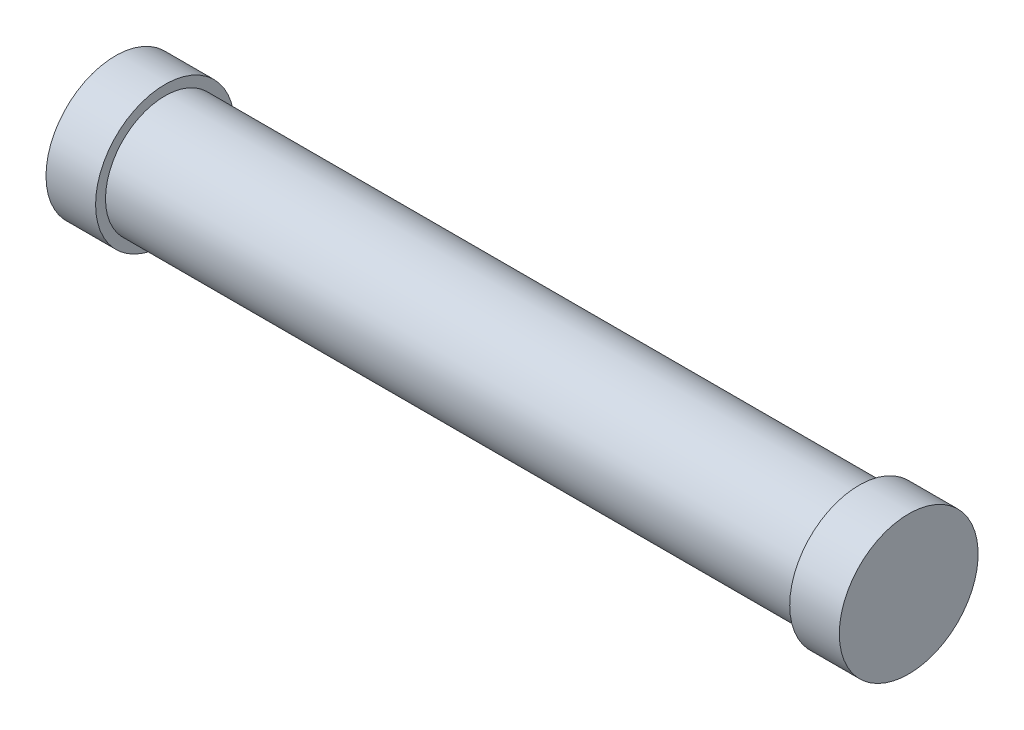
ISO-10303-21;
HEADER;
FILE_DESCRIPTION(('STEP AP214'),'2;1');
FILE_NAME('part.step','',(''),(''),'','','');
FILE_SCHEMA(('AUTOMOTIVE_DESIGN { 1 0 10303 214 1 1 1 1 }'));
ENDSEC;
DATA;
#1=APPLICATION_CONTEXT('core data for automotive mechanical design processes');
#2=APPLICATION_PROTOCOL_DEFINITION('international standard','automotive_design',2000,#1);
#3=PRODUCT_CONTEXT('',#1,'mechanical');
#4=PRODUCT('Part','Part','',(#3));
#5=PRODUCT_RELATED_PRODUCT_CATEGORY('part','',(#4));
#6=PRODUCT_DEFINITION_FORMATION('','',#4);
#7=PRODUCT_DEFINITION_CONTEXT('part definition',#1,'design');
#8=PRODUCT_DEFINITION('design','',#6,#7);
#9=PRODUCT_DEFINITION_SHAPE('','',#8);
#10=(LENGTH_UNIT() NAMED_UNIT(*) SI_UNIT(.MILLI.,.METRE.));
#11=(NAMED_UNIT(*) PLANE_ANGLE_UNIT() SI_UNIT($,.RADIAN.));
#12=(NAMED_UNIT(*) SI_UNIT($,.STERADIAN.) SOLID_ANGLE_UNIT());
#13=UNCERTAINTY_MEASURE_WITH_UNIT(LENGTH_MEASURE(1.E-05),#10,'distance_accuracy_value','');
#14=(GEOMETRIC_REPRESENTATION_CONTEXT(3) GLOBAL_UNCERTAINTY_ASSIGNED_CONTEXT((#13)) GLOBAL_UNIT_ASSIGNED_CONTEXT((#10,
#11,#12)) REPRESENTATION_CONTEXT('',''));
#15=CARTESIAN_POINT('',(0.,0.,0.));
#16=DIRECTION('',(0.,0.,1.));
#17=DIRECTION('',(1.,0.,0.));
#18=AXIS2_PLACEMENT_3D('',#15,#16,#17);
#19=CARTESIAN_POINT('',(-34.7204610951009,0.,-5.99999999999997));
#20=DIRECTION('',(-1.,0.,0.));
#21=DIRECTION('',(0.,0.,1.));
#22=AXIS2_PLACEMENT_3D('',#19,#20,#21);
#23=CYLINDRICAL_SURFACE('',#22,6.00000000000002);
#24=CARTESIAN_POINT('',(-34.7204610951009,0.,-5.99999999999997));
#25=DIRECTION('',(-1.,0.,0.));
#26=DIRECTION('',(0.,0.,1.));
#27=AXIS2_PLACEMENT_3D('',#24,#25,#26);
#28=CIRCLE('',#27,6.00000000000003);
#29=CARTESIAN_POINT('',(-34.7204610951009,0.,0.));
#30=VERTEX_POINT('',#29);
#31=EDGE_CURVE('E10',#30,#30,#28,.T.);
#32=ORIENTED_EDGE('',*,*,#31,.F.);
#33=EDGE_LOOP('',(#32));
#34=FACE_BOUND('',#33,.T.);
#35=CARTESIAN_POINT('',(35.2795389048992,0.,-5.99999999999997));
#36=DIRECTION('',(-1.,0.,0.));
#37=DIRECTION('',(0.,0.,1.));
#38=AXIS2_PLACEMENT_3D('',#35,#36,#37);
#39=CIRCLE('',#38,6.00000000000001);
#40=CARTESIAN_POINT('',(35.2795389048992,0.,0.));
#41=VERTEX_POINT('',#40);
#42=EDGE_CURVE('E37',#41,#41,#39,.T.);
#43=ORIENTED_EDGE('',*,*,#42,.T.);
#44=EDGE_LOOP('',(#43));
#45=FACE_BOUND('',#44,.T.);
#46=ADVANCED_FACE('F34',(#34,#45),#23,.T.);
#47=CARTESIAN_POINT('',(-39.7204610951009,0.,-5.99999999999997));
#48=DIRECTION('',(1.,0.,0.));
#49=DIRECTION('',(0.,0.,-1.));
#50=AXIS2_PLACEMENT_3D('',#47,#48,#49);
#51=CYLINDRICAL_SURFACE('',#50,7.);
#52=CARTESIAN_POINT('',(-39.7204610951009,0.,-5.99999999999997));
#53=DIRECTION('',(-1.,0.,0.));
#54=DIRECTION('',(0.,0.,1.));
#55=AXIS2_PLACEMENT_3D('',#52,#53,#54);
#56=CIRCLE('',#55,7.);
#57=CARTESIAN_POINT('',(-39.7204610951009,0.,1.00000000000003));
#58=VERTEX_POINT('',#57);
#59=EDGE_CURVE('E41',#58,#58,#56,.T.);
#60=ORIENTED_EDGE('',*,*,#59,.F.);
#61=EDGE_LOOP('',(#60));
#62=FACE_BOUND('',#61,.T.);
#63=CARTESIAN_POINT('',(-34.7204610951009,0.,-5.99999999999997));
#64=DIRECTION('',(-1.,0.,0.));
#65=DIRECTION('',(0.,0.,1.));
#66=AXIS2_PLACEMENT_3D('',#63,#64,#65);
#67=CIRCLE('',#66,7.);
#68=CARTESIAN_POINT('',(-34.7204610951009,0.,1.00000000000003));
#69=VERTEX_POINT('',#68);
#70=EDGE_CURVE('E45',#69,#69,#67,.T.);
#71=ORIENTED_EDGE('',*,*,#70,.T.);
#72=EDGE_LOOP('',(#71));
#73=FACE_BOUND('',#72,.T.);
#74=ADVANCED_FACE('F82',(#62,#73),#51,.T.);
#75=CARTESIAN_POINT('',(-39.7204610951009,0.,-5.99999999999997));
#76=DIRECTION('',(-1.,0.,0.));
#77=DIRECTION('',(0.,0.,1.));
#78=AXIS2_PLACEMENT_3D('',#75,#76,#77);
#79=PLANE('',#78);
#80=ORIENTED_EDGE('',*,*,#59,.T.);
#81=EDGE_LOOP('',(#80));
#82=FACE_BOUND('',#81,.T.);
#83=ADVANCED_FACE('F78',(#82),#79,.T.);
#84=CARTESIAN_POINT('',(-34.7204610951009,0.,-5.99999999999997));
#85=DIRECTION('',(-1.,0.,0.));
#86=DIRECTION('',(0.,0.,1.));
#87=AXIS2_PLACEMENT_3D('',#84,#85,#86);
#88=PLANE('',#87);
#89=ORIENTED_EDGE('',*,*,#31,.T.);
#90=EDGE_LOOP('',(#89));
#91=FACE_BOUND('',#90,.T.);
#92=ORIENTED_EDGE('',*,*,#70,.F.);
#93=EDGE_LOOP('',(#92));
#94=FACE_BOUND('',#93,.T.);
#95=ADVANCED_FACE('F70',(#91,#94),#88,.F.);
#96=CARTESIAN_POINT('',(40.2795389048992,0.,-5.99999999999997));
#97=DIRECTION('',(-1.,0.,0.));
#98=DIRECTION('',(0.,0.,1.));
#99=AXIS2_PLACEMENT_3D('',#96,#97,#98);
#100=CYLINDRICAL_SURFACE('',#99,7.);
#101=CARTESIAN_POINT('',(40.2795389048992,0.,-5.99999999999997));
#102=DIRECTION('',(-1.,0.,0.));
#103=DIRECTION('',(0.,0.,1.));
#104=AXIS2_PLACEMENT_3D('',#101,#102,#103);
#105=CIRCLE('',#104,7.);
#106=CARTESIAN_POINT('',(40.2795389048992,0.,1.00000000000003));
#107=VERTEX_POINT('',#106);
#108=EDGE_CURVE('E53',#107,#107,#105,.T.);
#109=ORIENTED_EDGE('',*,*,#108,.T.);
#110=EDGE_LOOP('',(#109));
#111=FACE_BOUND('',#110,.T.);
#112=CARTESIAN_POINT('',(35.2795389048992,0.,-5.99999999999997));
#113=DIRECTION('',(-1.,0.,0.));
#114=DIRECTION('',(0.,0.,1.));
#115=AXIS2_PLACEMENT_3D('',#112,#113,#114);
#116=CIRCLE('',#115,7.);
#117=CARTESIAN_POINT('',(35.2795389048992,0.,1.00000000000003));
#118=VERTEX_POINT('',#117);
#119=EDGE_CURVE('E50',#118,#118,#116,.T.);
#120=ORIENTED_EDGE('',*,*,#119,.F.);
#121=EDGE_LOOP('',(#120));
#122=FACE_BOUND('',#121,.T.);
#123=ADVANCED_FACE('F68',(#111,#122),#100,.T.);
#124=CARTESIAN_POINT('',(40.2795389048992,0.,-5.99999999999997));
#125=DIRECTION('',(1.,0.,0.));
#126=DIRECTION('',(0.,0.,1.));
#127=AXIS2_PLACEMENT_3D('',#124,#125,#126);
#128=PLANE('',#127);
#129=ORIENTED_EDGE('',*,*,#108,.F.);
#130=EDGE_LOOP('',(#129));
#131=FACE_BOUND('',#130,.T.);
#132=ADVANCED_FACE('F64',(#131),#128,.T.);
#133=CARTESIAN_POINT('',(35.2795389048992,0.,-5.99999999999997));
#134=DIRECTION('',(1.,0.,0.));
#135=DIRECTION('',(0.,0.,1.));
#136=AXIS2_PLACEMENT_3D('',#133,#134,#135);
#137=PLANE('',#136);
#138=ORIENTED_EDGE('',*,*,#42,.F.);
#139=EDGE_LOOP('',(#138));
#140=FACE_BOUND('',#139,.T.);
#141=ORIENTED_EDGE('',*,*,#119,.T.);
#142=EDGE_LOOP('',(#141));
#143=FACE_BOUND('',#142,.T.);
#144=ADVANCED_FACE('F61',(#140,#143),#137,.F.);
#145=CLOSED_SHELL('',(#46,#74,#83,#95,#123,#132,#144));
#146=MANIFOLD_SOLID_BREP('B2',#145);
#147=ADVANCED_BREP_SHAPE_REPRESENTATION('',(#18,#146),#14);
#148=SHAPE_DEFINITION_REPRESENTATION(#9,#147);
ENDSEC;
END-ISO-10303-21;
